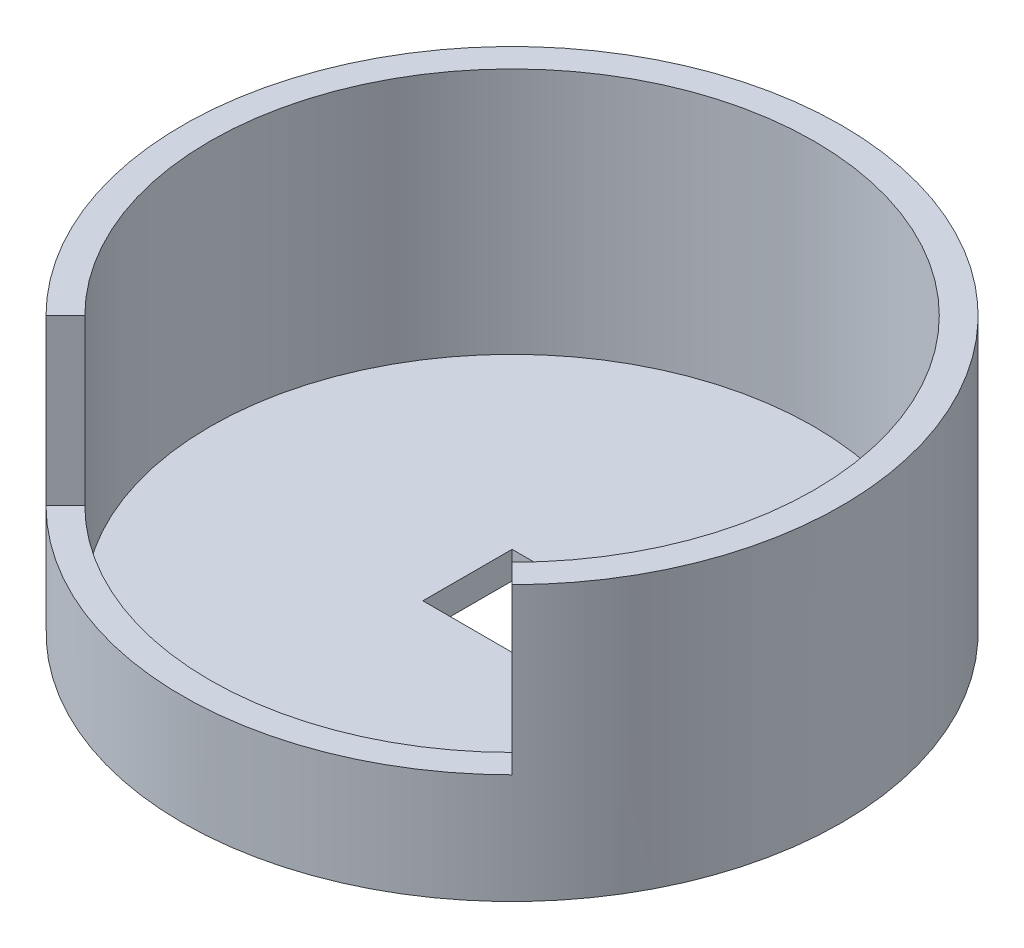
ISO-10303-21;
HEADER;
FILE_DESCRIPTION(('STEP AP214'),'2;1');
FILE_NAME('part.step','',(''),(''),'','','');
FILE_SCHEMA(('AUTOMOTIVE_DESIGN { 1 0 10303 214 1 1 1 1 }'));
ENDSEC;
DATA;
#1=APPLICATION_CONTEXT('core data for automotive mechanical design processes');
#2=APPLICATION_PROTOCOL_DEFINITION('international standard','automotive_design',2000,#1);
#3=PRODUCT_CONTEXT('',#1,'mechanical');
#4=PRODUCT('Part','Part','',(#3));
#5=PRODUCT_RELATED_PRODUCT_CATEGORY('part','',(#4));
#6=PRODUCT_DEFINITION_FORMATION('','',#4);
#7=PRODUCT_DEFINITION_CONTEXT('part definition',#1,'design');
#8=PRODUCT_DEFINITION('design','',#6,#7);
#9=PRODUCT_DEFINITION_SHAPE('','',#8);
#10=(LENGTH_UNIT() NAMED_UNIT(*) SI_UNIT(.MILLI.,.METRE.));
#11=(NAMED_UNIT(*) PLANE_ANGLE_UNIT() SI_UNIT($,.RADIAN.));
#12=(NAMED_UNIT(*) SI_UNIT($,.STERADIAN.) SOLID_ANGLE_UNIT());
#13=UNCERTAINTY_MEASURE_WITH_UNIT(LENGTH_MEASURE(1.E-05),#10,'distance_accuracy_value','');
#14=(GEOMETRIC_REPRESENTATION_CONTEXT(3) GLOBAL_UNCERTAINTY_ASSIGNED_CONTEXT((#13)) GLOBAL_UNIT_ASSIGNED_CONTEXT((#10,
#11,#12)) REPRESENTATION_CONTEXT('',''));
#15=CARTESIAN_POINT('',(0.,0.,0.));
#16=DIRECTION('',(0.,0.,1.));
#17=DIRECTION('',(1.,0.,0.));
#18=AXIS2_PLACEMENT_3D('',#15,#16,#17);
#19=CARTESIAN_POINT('',(0.,12.7,0.));
#20=DIRECTION('',(0.,-1.,0.));
#21=DIRECTION('',(0.,0.,-1.));
#22=AXIS2_PLACEMENT_3D('',#19,#20,#21);
#23=CYLINDRICAL_SURFACE('',#22,139.7);
#24=CARTESIAN_POINT('',(0.,12.7,0.));
#25=DIRECTION('',(0.,1.,0.));
#26=DIRECTION('',(0.,0.,1.));
#27=AXIS2_PLACEMENT_3D('',#24,#25,#26);
#28=CIRCLE('',#27,139.7);
#29=CARTESIAN_POINT('',(0.,12.7,139.7));
#30=VERTEX_POINT('',#29);
#31=EDGE_CURVE('E13',#30,#30,#28,.T.);
#32=ORIENTED_EDGE('',*,*,#31,.F.);
#33=EDGE_LOOP('',(#32));
#34=FACE_BOUND('',#33,.T.);
#35=CARTESIAN_POINT('',(0.,0.,0.));
#36=DIRECTION('',(0.,1.,0.));
#37=DIRECTION('',(0.,0.,1.));
#38=AXIS2_PLACEMENT_3D('',#35,#36,#37);
#39=CIRCLE('',#38,139.7);
#40=CARTESIAN_POINT('',(0.,0.,139.7));
#41=VERTEX_POINT('',#40);
#42=EDGE_CURVE('E75',#41,#41,#39,.T.);
#43=ORIENTED_EDGE('',*,*,#42,.T.);
#44=EDGE_LOOP('',(#43));
#45=FACE_BOUND('',#44,.T.);
#46=ADVANCED_FACE('F72',(#34,#45),#23,.T.);
#47=CARTESIAN_POINT('',(0.,12.7,0.));
#48=DIRECTION('',(0.,1.,0.));
#49=DIRECTION('',(0.,0.,1.));
#50=AXIS2_PLACEMENT_3D('',#47,#48,#49);
#51=PLANE('',#50);
#52=DIRECTION('',(1.,0.,0.));
#53=VECTOR('',#52,1.);
#54=CARTESIAN_POINT('',(-20.6375,12.7,-20.6375));
#55=LINE('',#54,#53);
#56=CARTESIAN_POINT('',(-20.6375,12.7,-20.6375));
#57=VERTEX_POINT('',#56);
#58=CARTESIAN_POINT('',(20.6375,12.7,-20.6375));
#59=VERTEX_POINT('',#58);
#60=EDGE_CURVE('E119',#57,#59,#55,.T.);
#61=ORIENTED_EDGE('',*,*,#60,.T.);
#62=DIRECTION('',(0.,0.,-1.));
#63=VECTOR('',#62,1.);
#64=CARTESIAN_POINT('',(20.6375,12.7,20.6375));
#65=LINE('',#64,#63);
#66=CARTESIAN_POINT('',(20.6375,12.7,20.6375));
#67=VERTEX_POINT('',#66);
#68=EDGE_CURVE('E111',#67,#59,#65,.T.);
#69=ORIENTED_EDGE('',*,*,#68,.F.);
#70=DIRECTION('',(1.,0.,0.));
#71=VECTOR('',#70,1.);
#72=CARTESIAN_POINT('',(-20.6375,12.7,20.6375));
#73=LINE('',#72,#71);
#74=CARTESIAN_POINT('',(-20.6375,12.7,20.6375));
#75=VERTEX_POINT('',#74);
#76=EDGE_CURVE('E118',#75,#67,#73,.T.);
#77=ORIENTED_EDGE('',*,*,#76,.F.);
#78=DIRECTION('',(0.,0.,-1.));
#79=VECTOR('',#78,1.);
#80=CARTESIAN_POINT('',(-20.6375,12.7,20.6375));
#81=LINE('',#80,#79);
#82=EDGE_CURVE('E124',#75,#57,#81,.T.);
#83=ORIENTED_EDGE('',*,*,#82,.T.);
#84=EDGE_LOOP('',(#61,#69,#77,#83));
#85=FACE_BOUND('',#84,.T.);
#86=ORIENTED_EDGE('',*,*,#31,.T.);
#87=EDGE_LOOP('',(#86));
#88=FACE_BOUND('',#87,.T.);
#89=ADVANCED_FACE('F126',(#85,#88),#51,.T.);
#90=CARTESIAN_POINT('',(0.,0.,0.));
#91=DIRECTION('',(0.,1.,0.));
#92=DIRECTION('',(0.,0.,1.));
#93=AXIS2_PLACEMENT_3D('',#90,#91,#92);
#94=PLANE('',#93);
#95=DIRECTION('',(0.,0.,-1.));
#96=VECTOR('',#95,1.);
#97=CARTESIAN_POINT('',(20.6375,0.,20.6375));
#98=LINE('',#97,#96);
#99=CARTESIAN_POINT('',(20.6375,0.,20.6375));
#100=VERTEX_POINT('',#99);
#101=CARTESIAN_POINT('',(20.6375,0.,-20.6375));
#102=VERTEX_POINT('',#101);
#103=EDGE_CURVE('E138',#100,#102,#98,.T.);
#104=ORIENTED_EDGE('',*,*,#103,.T.);
#105=DIRECTION('',(1.,0.,0.));
#106=VECTOR('',#105,1.);
#107=CARTESIAN_POINT('',(-20.6375,0.,-20.6375));
#108=LINE('',#107,#106);
#109=CARTESIAN_POINT('',(-20.6375,0.,-20.6375));
#110=VERTEX_POINT('',#109);
#111=EDGE_CURVE('E94',#110,#102,#108,.T.);
#112=ORIENTED_EDGE('',*,*,#111,.F.);
#113=DIRECTION('',(0.,0.,-1.));
#114=VECTOR('',#113,1.);
#115=CARTESIAN_POINT('',(-20.6375,0.,20.6375));
#116=LINE('',#115,#114);
#117=CARTESIAN_POINT('',(-20.6375,0.,20.6375));
#118=VERTEX_POINT('',#117);
#119=EDGE_CURVE('E129',#118,#110,#116,.T.);
#120=ORIENTED_EDGE('',*,*,#119,.F.);
#121=DIRECTION('',(1.,0.,0.));
#122=VECTOR('',#121,1.);
#123=CARTESIAN_POINT('',(-20.6375,0.,20.6375));
#124=LINE('',#123,#122);
#125=EDGE_CURVE('E132',#118,#100,#124,.T.);
#126=ORIENTED_EDGE('',*,*,#125,.T.);
#127=EDGE_LOOP('',(#104,#112,#120,#126));
#128=FACE_BOUND('',#127,.T.);
#129=ORIENTED_EDGE('',*,*,#42,.F.);
#130=EDGE_LOOP('',(#129));
#131=FACE_BOUND('',#130,.T.);
#132=ADVANCED_FACE('F151',(#128,#131),#94,.F.);
#133=CARTESIAN_POINT('',(-20.6375,12.7,-20.6375));
#134=DIRECTION('',(0.,0.,-1.));
#135=DIRECTION('',(-1.,0.,0.));
#136=AXIS2_PLACEMENT_3D('',#133,#134,#135);
#137=PLANE('',#136);
#138=ORIENTED_EDGE('',*,*,#111,.T.);
#139=DIRECTION('',(0.,-1.,0.));
#140=VECTOR('',#139,1.);
#141=CARTESIAN_POINT('',(20.6375,12.7,-20.6375));
#142=LINE('',#141,#140);
#143=EDGE_CURVE('E113',#59,#102,#142,.T.);
#144=ORIENTED_EDGE('',*,*,#143,.F.);
#145=ORIENTED_EDGE('',*,*,#60,.F.);
#146=DIRECTION('',(0.,-1.,0.));
#147=VECTOR('',#146,1.);
#148=CARTESIAN_POINT('',(-20.6375,12.7,-20.6375));
#149=LINE('',#148,#147);
#150=EDGE_CURVE('E142',#57,#110,#149,.T.);
#151=ORIENTED_EDGE('',*,*,#150,.T.);
#152=EDGE_LOOP('',(#138,#144,#145,#151));
#153=FACE_BOUND('',#152,.T.);
#154=ADVANCED_FACE('F122',(#153),#137,.F.);
#155=CARTESIAN_POINT('',(-20.6375,12.7,20.6375));
#156=DIRECTION('',(-1.,0.,0.));
#157=DIRECTION('',(0.,0.,1.));
#158=AXIS2_PLACEMENT_3D('',#155,#156,#157);
#159=PLANE('',#158);
#160=ORIENTED_EDGE('',*,*,#119,.T.);
#161=ORIENTED_EDGE('',*,*,#150,.F.);
#162=ORIENTED_EDGE('',*,*,#82,.F.);
#163=DIRECTION('',(0.,-1.,0.));
#164=VECTOR('',#163,1.);
#165=CARTESIAN_POINT('',(-20.6375,12.7,20.6375));
#166=LINE('',#165,#164);
#167=EDGE_CURVE('E144',#75,#118,#166,.T.);
#168=ORIENTED_EDGE('',*,*,#167,.T.);
#169=EDGE_LOOP('',(#160,#161,#162,#168));
#170=FACE_BOUND('',#169,.T.);
#171=ADVANCED_FACE('F154',(#170),#159,.F.);
#172=CARTESIAN_POINT('',(-20.6375,12.7,20.6375));
#173=DIRECTION('',(0.,0.,-1.));
#174=DIRECTION('',(-1.,0.,0.));
#175=AXIS2_PLACEMENT_3D('',#172,#173,#174);
#176=PLANE('',#175);
#177=ORIENTED_EDGE('',*,*,#125,.F.);
#178=ORIENTED_EDGE('',*,*,#167,.F.);
#179=ORIENTED_EDGE('',*,*,#76,.T.);
#180=DIRECTION('',(0.,-1.,0.));
#181=VECTOR('',#180,1.);
#182=CARTESIAN_POINT('',(20.6375,12.7,20.6375));
#183=LINE('',#182,#181);
#184=EDGE_CURVE('E86',#67,#100,#183,.T.);
#185=ORIENTED_EDGE('',*,*,#184,.T.);
#186=EDGE_LOOP('',(#177,#178,#179,#185));
#187=FACE_BOUND('',#186,.T.);
#188=ADVANCED_FACE('F148',(#187),#176,.T.);
#189=CARTESIAN_POINT('',(20.6375,12.7,20.6375));
#190=DIRECTION('',(-1.,0.,0.));
#191=DIRECTION('',(0.,0.,1.));
#192=AXIS2_PLACEMENT_3D('',#189,#190,#191);
#193=PLANE('',#192);
#194=ORIENTED_EDGE('',*,*,#103,.F.);
#195=ORIENTED_EDGE('',*,*,#184,.F.);
#196=ORIENTED_EDGE('',*,*,#68,.T.);
#197=ORIENTED_EDGE('',*,*,#143,.T.);
#198=EDGE_LOOP('',(#194,#195,#196,#197));
#199=FACE_BOUND('',#198,.T.);
#200=ADVANCED_FACE('F112',(#199),#193,.T.);
#201=CLOSED_SHELL('',(#46,#89,#132,#154,#171,#188,#200));
#202=MANIFOLD_SOLID_BREP('B2',#201);
#203=CARTESIAN_POINT('',(0.,0.,0.));
#204=DIRECTION('',(0.,-1.,0.));
#205=DIRECTION('',(0.,0.,-1.));
#206=AXIS2_PLACEMENT_3D('',#203,#204,#205);
#207=CYLINDRICAL_SURFACE('',#206,139.794899658551);
#208=CARTESIAN_POINT('',(0.,50.8,0.));
#209=DIRECTION('',(0.,-1.,0.));
#210=DIRECTION('',(0.,0.,-1.));
#211=AXIS2_PLACEMENT_3D('',#208,#209,#210);
#212=CIRCLE('',#211,139.794899658551);
#213=CARTESIAN_POINT('',(98.8499215238542,50.8,98.8499215238541));
#214=VERTEX_POINT('',#213);
#215=CARTESIAN_POINT('',(-98.8499215238528,50.8,98.8499215238555));
#216=VERTEX_POINT('',#215);
#217=EDGE_CURVE('E241',#214,#216,#212,.T.);
#218=ORIENTED_EDGE('',*,*,#217,.F.);
#219=DIRECTION('',(0.,1.,0.));
#220=VECTOR('',#219,1.);
#221=CARTESIAN_POINT('',(98.8499215238542,0.,98.8499215238542));
#222=LINE('',#221,#220);
#223=CARTESIAN_POINT('',(98.8499215238541,127.,98.8499215238542));
#224=VERTEX_POINT('',#223);
#225=EDGE_CURVE('E260',#214,#224,#222,.T.);
#226=ORIENTED_EDGE('',*,*,#225,.T.);
#227=CARTESIAN_POINT('',(0.,127.,0.));
#228=DIRECTION('',(0.,-1.,0.));
#229=DIRECTION('',(0.,0.,-1.));
#230=AXIS2_PLACEMENT_3D('',#227,#228,#229);
#231=CIRCLE('',#230,139.794899658551);
#232=CARTESIAN_POINT('',(-98.8499215238528,127.,98.8499215238555));
#233=VERTEX_POINT('',#232);
#234=EDGE_CURVE('E263',#233,#224,#231,.T.);
#235=ORIENTED_EDGE('',*,*,#234,.F.);
#236=DIRECTION('',(0.,1.,0.));
#237=VECTOR('',#236,1.);
#238=CARTESIAN_POINT('',(-98.8499215238528,0.,98.8499215238556));
#239=LINE('',#238,#237);
#240=EDGE_CURVE('E287',#216,#233,#239,.T.);
#241=ORIENTED_EDGE('',*,*,#240,.F.);
#242=EDGE_LOOP('',(#218,#226,#235,#241));
#243=FACE_BOUND('',#242,.T.);
#244=CARTESIAN_POINT('',(0.,0.,0.));
#245=DIRECTION('',(0.,-1.,0.));
#246=DIRECTION('',(0.,0.,-1.));
#247=AXIS2_PLACEMENT_3D('',#244,#245,#246);
#248=CIRCLE('',#247,139.794899658551);
#249=CARTESIAN_POINT('',(0.,0.,-139.794899658551));
#250=VERTEX_POINT('',#249);
#251=EDGE_CURVE('E70',#250,#250,#248,.T.);
#252=ORIENTED_EDGE('',*,*,#251,.T.);
#253=EDGE_LOOP('',(#252));
#254=FACE_BOUND('',#253,.T.);
#255=ADVANCED_FACE('F217',(#243,#254),#207,.F.);
#256=CARTESIAN_POINT('',(107.830177644923,0.,107.830177644923));
#257=DIRECTION('',(0.,1.,0.));
#258=DIRECTION('',(0.,0.,1.));
#259=AXIS2_PLACEMENT_3D('',#256,#257,#258);
#260=PLANE('',#259);
#261=ORIENTED_EDGE('',*,*,#251,.F.);
#262=EDGE_LOOP('',(#261));
#263=FACE_BOUND('',#262,.T.);
#264=CARTESIAN_POINT('',(0.,0.,0.));
#265=DIRECTION('',(0.,-1.,0.));
#266=DIRECTION('',(0.,0.,-1.));
#267=AXIS2_PLACEMENT_3D('',#264,#265,#266);
#268=CIRCLE('',#267,152.494899658551);
#269=CARTESIAN_POINT('',(0.,0.,-152.494899658551));
#270=VERTEX_POINT('',#269);
#271=EDGE_CURVE('E226',#270,#270,#268,.T.);
#272=ORIENTED_EDGE('',*,*,#271,.T.);
#273=EDGE_LOOP('',(#272));
#274=FACE_BOUND('',#273,.T.);
#275=ADVANCED_FACE('F219',(#263,#274),#260,.F.);
#276=CARTESIAN_POINT('',(0.,0.,0.));
#277=DIRECTION('',(0.,-1.,0.));
#278=DIRECTION('',(0.,0.,-1.));
#279=AXIS2_PLACEMENT_3D('',#276,#277,#278);
#280=CYLINDRICAL_SURFACE('',#279,152.494899658551);
#281=DIRECTION('',(0.,1.,0.));
#282=VECTOR('',#281,1.);
#283=CARTESIAN_POINT('',(107.830177644923,0.,107.830177644923));
#284=LINE('',#283,#282);
#285=CARTESIAN_POINT('',(107.830177644923,50.8,107.830177644923));
#286=VERTEX_POINT('',#285);
#287=CARTESIAN_POINT('',(107.830177644923,127.,107.830177644923));
#288=VERTEX_POINT('',#287);
#289=EDGE_CURVE('E282',#286,#288,#284,.T.);
#290=ORIENTED_EDGE('',*,*,#289,.F.);
#291=CARTESIAN_POINT('',(0.,50.8,0.));
#292=DIRECTION('',(0.,-1.,0.));
#293=DIRECTION('',(0.,0.,-1.));
#294=AXIS2_PLACEMENT_3D('',#291,#292,#293);
#295=CIRCLE('',#294,152.494899658551);
#296=CARTESIAN_POINT('',(-107.830177644922,50.8,107.830177644925));
#297=VERTEX_POINT('',#296);
#298=EDGE_CURVE('E233',#286,#297,#295,.T.);
#299=ORIENTED_EDGE('',*,*,#298,.T.);
#300=DIRECTION('',(0.,1.,0.));
#301=VECTOR('',#300,1.);
#302=CARTESIAN_POINT('',(-107.830177644922,0.,107.830177644925));
#303=LINE('',#302,#301);
#304=CARTESIAN_POINT('',(-107.830177644922,127.,107.830177644925));
#305=VERTEX_POINT('',#304);
#306=EDGE_CURVE('E294',#297,#305,#303,.T.);
#307=ORIENTED_EDGE('',*,*,#306,.T.);
#308=CARTESIAN_POINT('',(0.,127.,0.));
#309=DIRECTION('',(0.,-1.,0.));
#310=DIRECTION('',(0.,0.,-1.));
#311=AXIS2_PLACEMENT_3D('',#308,#309,#310);
#312=CIRCLE('',#311,152.494899658551);
#313=EDGE_CURVE('E278',#305,#288,#312,.T.);
#314=ORIENTED_EDGE('',*,*,#313,.T.);
#315=EDGE_LOOP('',(#290,#299,#307,#314));
#316=FACE_BOUND('',#315,.T.);
#317=ORIENTED_EDGE('',*,*,#271,.F.);
#318=EDGE_LOOP('',(#317));
#319=FACE_BOUND('',#318,.T.);
#320=ADVANCED_FACE('F312',(#316,#319),#280,.T.);
#321=CARTESIAN_POINT('',(107.830177644923,50.8,107.830177644923));
#322=DIRECTION('',(0.,1.,0.));
#323=DIRECTION('',(0.,0.,1.));
#324=AXIS2_PLACEMENT_3D('',#321,#322,#323);
#325=PLANE('',#324);
#326=DIRECTION('',(-0.707106781186548,0.,-0.707106781186548));
#327=VECTOR('',#326,1.);
#328=CARTESIAN_POINT('',(107.830177644923,50.8,107.830177644923));
#329=LINE('',#328,#327);
#330=EDGE_CURVE('E301',#286,#214,#329,.T.);
#331=ORIENTED_EDGE('',*,*,#330,.T.);
#332=ORIENTED_EDGE('',*,*,#217,.T.);
#333=DIRECTION('',(0.707106781186548,0.,-0.707106781186548));
#334=VECTOR('',#333,1.);
#335=CARTESIAN_POINT('',(-107.830177644923,50.8,107.830177644923));
#336=LINE('',#335,#334);
#337=EDGE_CURVE('E277',#297,#216,#336,.T.);
#338=ORIENTED_EDGE('',*,*,#337,.F.);
#339=ORIENTED_EDGE('',*,*,#298,.F.);
#340=EDGE_LOOP('',(#331,#332,#338,#339));
#341=FACE_BOUND('',#340,.T.);
#342=ADVANCED_FACE('F314',(#341),#325,.T.);
#343=CARTESIAN_POINT('',(-107.830177644922,127.,107.830177644925));
#344=DIRECTION('',(0.,1.,0.));
#345=DIRECTION('',(0.,0.,1.));
#346=AXIS2_PLACEMENT_3D('',#343,#344,#345);
#347=PLANE('',#346);
#348=ORIENTED_EDGE('',*,*,#313,.F.);
#349=DIRECTION('',(0.707106781186538,0.,-0.707106781186557));
#350=VECTOR('',#349,1.);
#351=CARTESIAN_POINT('',(-107.830177644922,127.,107.830177644925));
#352=LINE('',#351,#350);
#353=EDGE_CURVE('E275',#305,#233,#352,.T.);
#354=ORIENTED_EDGE('',*,*,#353,.T.);
#355=ORIENTED_EDGE('',*,*,#234,.T.);
#356=DIRECTION('',(-0.707106781186548,0.,-0.707106781186548));
#357=VECTOR('',#356,1.);
#358=CARTESIAN_POINT('',(107.830177644923,127.,107.830177644923));
#359=LINE('',#358,#357);
#360=EDGE_CURVE('E268',#288,#224,#359,.T.);
#361=ORIENTED_EDGE('',*,*,#360,.F.);
#362=EDGE_LOOP('',(#348,#354,#355,#361));
#363=FACE_BOUND('',#362,.T.);
#364=ADVANCED_FACE('F273',(#363),#347,.T.);
#365=CARTESIAN_POINT('',(0.,0.,0.));
#366=DIRECTION('',(-0.707106781186557,0.,-0.707106781186538));
#367=DIRECTION('',(-0.707106781186538,0.,0.707106781186557));
#368=AXIS2_PLACEMENT_3D('',#365,#366,#367);
#369=PLANE('',#368);
#370=ORIENTED_EDGE('',*,*,#337,.T.);
#371=ORIENTED_EDGE('',*,*,#240,.T.);
#372=ORIENTED_EDGE('',*,*,#353,.F.);
#373=ORIENTED_EDGE('',*,*,#306,.F.);
#374=EDGE_LOOP('',(#370,#371,#372,#373));
#375=FACE_BOUND('',#374,.T.);
#376=ADVANCED_FACE('F329',(#375),#369,.F.);
#377=CARTESIAN_POINT('',(0.,0.,0.));
#378=DIRECTION('',(-0.707106781186548,0.,0.707106781186548));
#379=DIRECTION('',(0.707106781186548,0.,0.707106781186548));
#380=AXIS2_PLACEMENT_3D('',#377,#378,#379);
#381=PLANE('',#380);
#382=ORIENTED_EDGE('',*,*,#225,.F.);
#383=ORIENTED_EDGE('',*,*,#330,.F.);
#384=ORIENTED_EDGE('',*,*,#289,.T.);
#385=ORIENTED_EDGE('',*,*,#360,.T.);
#386=EDGE_LOOP('',(#382,#383,#384,#385));
#387=FACE_BOUND('',#386,.T.);
#388=ADVANCED_FACE('F280',(#387),#381,.T.);
#389=CLOSED_SHELL('',(#255,#275,#320,#342,#364,#376,#388));
#390=MANIFOLD_SOLID_BREP('B7',#389);
#391=ADVANCED_BREP_SHAPE_REPRESENTATION('',(#18,#202,#390),#14);
#392=SHAPE_DEFINITION_REPRESENTATION(#9,#391);
ENDSEC;
END-ISO-10303-21;
